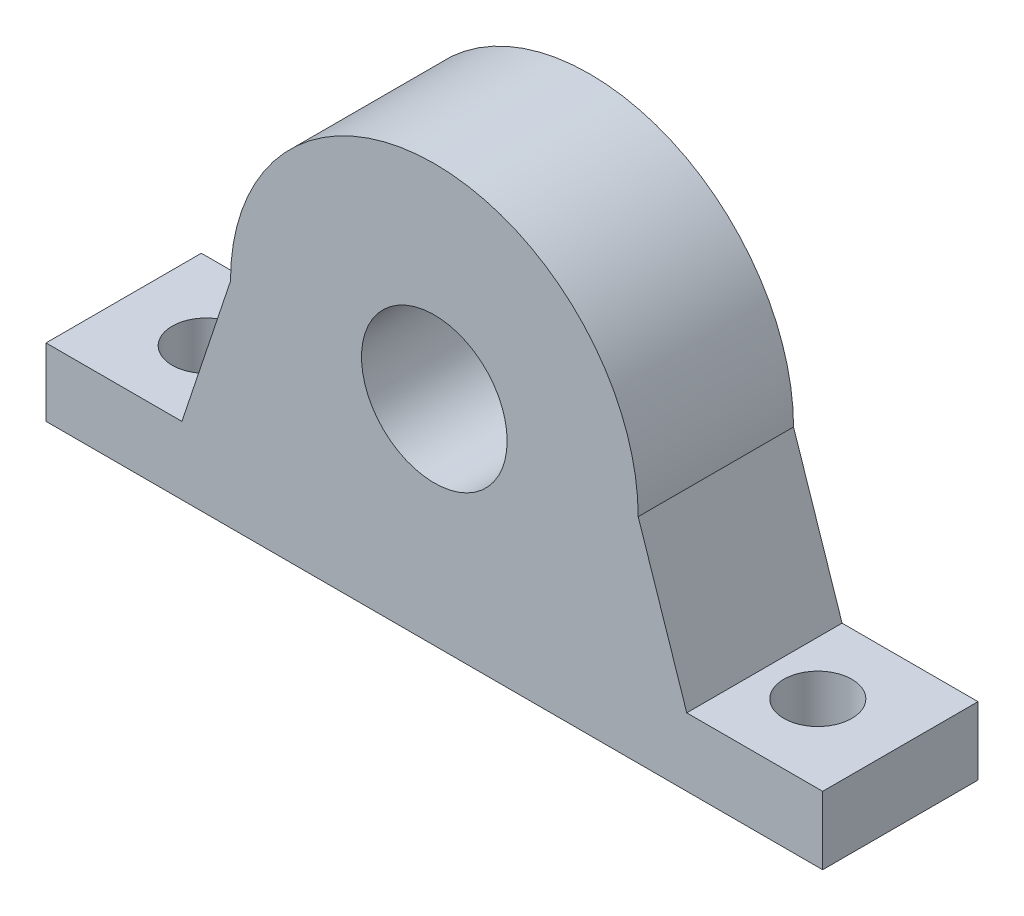
ISO-10303-21;
HEADER;
FILE_DESCRIPTION(('STEP AP214'),'2;1');
FILE_NAME('part.step','',(''),(''),'','','');
FILE_SCHEMA(('AUTOMOTIVE_DESIGN { 1 0 10303 214 1 1 1 1 }'));
ENDSEC;
DATA;
#1=APPLICATION_CONTEXT('core data for automotive mechanical design processes');
#2=APPLICATION_PROTOCOL_DEFINITION('international standard','automotive_design',2000,#1);
#3=PRODUCT_CONTEXT('',#1,'mechanical');
#4=PRODUCT('Part','Part','',(#3));
#5=PRODUCT_RELATED_PRODUCT_CATEGORY('part','',(#4));
#6=PRODUCT_DEFINITION_FORMATION('','',#4);
#7=PRODUCT_DEFINITION_CONTEXT('part definition',#1,'design');
#8=PRODUCT_DEFINITION('design','',#6,#7);
#9=PRODUCT_DEFINITION_SHAPE('','',#8);
#10=(LENGTH_UNIT() NAMED_UNIT(*) SI_UNIT(.MILLI.,.METRE.));
#11=(NAMED_UNIT(*) PLANE_ANGLE_UNIT() SI_UNIT($,.RADIAN.));
#12=(NAMED_UNIT(*) SI_UNIT($,.STERADIAN.) SOLID_ANGLE_UNIT());
#13=UNCERTAINTY_MEASURE_WITH_UNIT(LENGTH_MEASURE(1.E-05),#10,'distance_accuracy_value','');
#14=(GEOMETRIC_REPRESENTATION_CONTEXT(3) GLOBAL_UNCERTAINTY_ASSIGNED_CONTEXT((#13)) GLOBAL_UNIT_ASSIGNED_CONTEXT((#10,
#11,#12)) REPRESENTATION_CONTEXT('',''));
#15=CARTESIAN_POINT('',(0.,0.,0.));
#16=DIRECTION('',(0.,0.,1.));
#17=DIRECTION('',(1.,0.,0.));
#18=AXIS2_PLACEMENT_3D('',#15,#16,#17);
#19=CARTESIAN_POINT('',(0.,0.,16.));
#20=DIRECTION('',(0.,0.,-1.));
#21=DIRECTION('',(-1.,0.,0.));
#22=AXIS2_PLACEMENT_3D('',#19,#20,#21);
#23=PLANE('',#22);
#24=CARTESIAN_POINT('',(0.,0.,16.));
#25=DIRECTION('',(0.,0.,1.));
#26=DIRECTION('',(-1.,0.,0.));
#27=AXIS2_PLACEMENT_3D('',#24,#25,#26);
#28=CIRCLE('',#27,21.);
#29=CARTESIAN_POINT('',(21.,0.,16.));
#30=VERTEX_POINT('',#29);
#31=CARTESIAN_POINT('',(-21.,0.,16.));
#32=VERTEX_POINT('',#31);
#33=EDGE_CURVE('E147',#30,#32,#28,.T.);
#34=ORIENTED_EDGE('',*,*,#33,.T.);
#35=DIRECTION('',(-0.316227766016838,-0.948683298050514,0.));
#36=VECTOR('',#35,1.);
#37=CARTESIAN_POINT('',(-21.,0.,16.));
#38=LINE('',#37,#36);
#39=CARTESIAN_POINT('',(-26.,-15.,16.));
#40=VERTEX_POINT('',#39);
#41=EDGE_CURVE('E95',#32,#40,#38,.T.);
#42=ORIENTED_EDGE('',*,*,#41,.T.);
#43=DIRECTION('',(-1.,0.,0.));
#44=VECTOR('',#43,1.);
#45=CARTESIAN_POINT('',(-26.,-15.,16.));
#46=LINE('',#45,#44);
#47=CARTESIAN_POINT('',(-40.,-15.,16.));
#48=VERTEX_POINT('',#47);
#49=EDGE_CURVE('E162',#40,#48,#46,.T.);
#50=ORIENTED_EDGE('',*,*,#49,.T.);
#51=DIRECTION('',(0.,-1.,0.));
#52=VECTOR('',#51,1.);
#53=CARTESIAN_POINT('',(-40.,-15.,16.));
#54=LINE('',#53,#52);
#55=CARTESIAN_POINT('',(-40.,-22.,16.));
#56=VERTEX_POINT('',#55);
#57=EDGE_CURVE('E175',#48,#56,#54,.T.);
#58=ORIENTED_EDGE('',*,*,#57,.T.);
#59=DIRECTION('',(1.,0.,0.));
#60=VECTOR('',#59,1.);
#61=CARTESIAN_POINT('',(-40.,-22.,16.));
#62=LINE('',#61,#60);
#63=CARTESIAN_POINT('',(40.,-22.,16.));
#64=VERTEX_POINT('',#63);
#65=EDGE_CURVE('E114',#56,#64,#62,.T.);
#66=ORIENTED_EDGE('',*,*,#65,.T.);
#67=DIRECTION('',(0.,1.,0.));
#68=VECTOR('',#67,1.);
#69=CARTESIAN_POINT('',(40.,-22.,16.));
#70=LINE('',#69,#68);
#71=CARTESIAN_POINT('',(40.,-15.,16.));
#72=VERTEX_POINT('',#71);
#73=EDGE_CURVE('E108',#64,#72,#70,.T.);
#74=ORIENTED_EDGE('',*,*,#73,.T.);
#75=DIRECTION('',(-1.,0.,0.));
#76=VECTOR('',#75,1.);
#77=CARTESIAN_POINT('',(40.,-15.,16.));
#78=LINE('',#77,#76);
#79=CARTESIAN_POINT('',(26.,-15.,16.));
#80=VERTEX_POINT('',#79);
#81=EDGE_CURVE('E112',#72,#80,#78,.T.);
#82=ORIENTED_EDGE('',*,*,#81,.T.);
#83=DIRECTION('',(-0.316227766016838,0.948683298050514,0.));
#84=VECTOR('',#83,1.);
#85=CARTESIAN_POINT('',(26.,-15.,16.));
#86=LINE('',#85,#84);
#87=EDGE_CURVE('E52',#80,#30,#86,.T.);
#88=ORIENTED_EDGE('',*,*,#87,.T.);
#89=EDGE_LOOP('',(#34,#42,#50,#58,#66,#74,#82,#88));
#90=FACE_BOUND('',#89,.T.);
#91=CARTESIAN_POINT('',(0.,0.,16.));
#92=DIRECTION('',(0.,0.,1.));
#93=DIRECTION('',(1.,0.,0.));
#94=AXIS2_PLACEMENT_3D('',#91,#92,#93);
#95=CIRCLE('',#94,7.5);
#96=CARTESIAN_POINT('',(7.5,0.,16.));
#97=VERTEX_POINT('',#96);
#98=EDGE_CURVE('E136',#97,#97,#95,.T.);
#99=ORIENTED_EDGE('',*,*,#98,.F.);
#100=EDGE_LOOP('',(#99));
#101=FACE_BOUND('',#100,.T.);
#102=ADVANCED_FACE('F35',(#90,#101),#23,.F.);
#103=CARTESIAN_POINT('',(0.,0.,0.));
#104=DIRECTION('',(0.,0.,-1.));
#105=DIRECTION('',(-1.,0.,0.));
#106=AXIS2_PLACEMENT_3D('',#103,#104,#105);
#107=PLANE('',#106);
#108=CARTESIAN_POINT('',(0.,0.,0.));
#109=DIRECTION('',(0.,0.,1.));
#110=DIRECTION('',(-1.,0.,0.));
#111=AXIS2_PLACEMENT_3D('',#108,#109,#110);
#112=CIRCLE('',#111,21.);
#113=CARTESIAN_POINT('',(21.,0.,0.));
#114=VERTEX_POINT('',#113);
#115=CARTESIAN_POINT('',(-21.,0.,0.));
#116=VERTEX_POINT('',#115);
#117=EDGE_CURVE('E132',#114,#116,#112,.T.);
#118=ORIENTED_EDGE('',*,*,#117,.F.);
#119=DIRECTION('',(-0.316227766016838,0.948683298050514,0.));
#120=VECTOR('',#119,1.);
#121=CARTESIAN_POINT('',(26.,-15.,0.));
#122=LINE('',#121,#120);
#123=CARTESIAN_POINT('',(26.,-15.,0.));
#124=VERTEX_POINT('',#123);
#125=EDGE_CURVE('E87',#124,#114,#122,.T.);
#126=ORIENTED_EDGE('',*,*,#125,.F.);
#127=DIRECTION('',(-1.,0.,0.));
#128=VECTOR('',#127,1.);
#129=CARTESIAN_POINT('',(40.,-15.,0.));
#130=LINE('',#129,#128);
#131=CARTESIAN_POINT('',(40.,-15.,0.));
#132=VERTEX_POINT('',#131);
#133=EDGE_CURVE('E81',#132,#124,#130,.T.);
#134=ORIENTED_EDGE('',*,*,#133,.F.);
#135=DIRECTION('',(0.,1.,0.));
#136=VECTOR('',#135,1.);
#137=CARTESIAN_POINT('',(40.,-22.,0.));
#138=LINE('',#137,#136);
#139=CARTESIAN_POINT('',(40.,-22.,0.));
#140=VERTEX_POINT('',#139);
#141=EDGE_CURVE('E122',#140,#132,#138,.T.);
#142=ORIENTED_EDGE('',*,*,#141,.F.);
#143=DIRECTION('',(1.,0.,0.));
#144=VECTOR('',#143,1.);
#145=CARTESIAN_POINT('',(-40.,-22.,0.));
#146=LINE('',#145,#144);
#147=CARTESIAN_POINT('',(-40.,-22.,0.));
#148=VERTEX_POINT('',#147);
#149=EDGE_CURVE('E142',#148,#140,#146,.T.);
#150=ORIENTED_EDGE('',*,*,#149,.F.);
#151=DIRECTION('',(0.,-1.,0.));
#152=VECTOR('',#151,1.);
#153=CARTESIAN_POINT('',(-40.,-15.,0.));
#154=LINE('',#153,#152);
#155=CARTESIAN_POINT('',(-40.,-15.,0.));
#156=VERTEX_POINT('',#155);
#157=EDGE_CURVE('E140',#156,#148,#154,.T.);
#158=ORIENTED_EDGE('',*,*,#157,.F.);
#159=DIRECTION('',(-1.,0.,0.));
#160=VECTOR('',#159,1.);
#161=CARTESIAN_POINT('',(-26.,-15.,0.));
#162=LINE('',#161,#160);
#163=CARTESIAN_POINT('',(-26.,-15.,0.));
#164=VERTEX_POINT('',#163);
#165=EDGE_CURVE('E138',#164,#156,#162,.T.);
#166=ORIENTED_EDGE('',*,*,#165,.F.);
#167=DIRECTION('',(-0.316227766016838,-0.948683298050514,0.));
#168=VECTOR('',#167,1.);
#169=CARTESIAN_POINT('',(-21.,0.,0.));
#170=LINE('',#169,#168);
#171=EDGE_CURVE('E135',#116,#164,#170,.T.);
#172=ORIENTED_EDGE('',*,*,#171,.F.);
#173=EDGE_LOOP('',(#118,#126,#134,#142,#150,#158,#166,#172));
#174=FACE_BOUND('',#173,.T.);
#175=CARTESIAN_POINT('',(0.,0.,0.));
#176=DIRECTION('',(0.,0.,1.));
#177=DIRECTION('',(1.,0.,0.));
#178=AXIS2_PLACEMENT_3D('',#175,#176,#177);
#179=CIRCLE('',#178,7.5);
#180=CARTESIAN_POINT('',(7.5,0.,0.));
#181=VERTEX_POINT('',#180);
#182=EDGE_CURVE('E181',#181,#181,#179,.T.);
#183=ORIENTED_EDGE('',*,*,#182,.T.);
#184=EDGE_LOOP('',(#183));
#185=FACE_BOUND('',#184,.T.);
#186=ADVANCED_FACE('F166',(#174,#185),#107,.T.);
#187=CARTESIAN_POINT('',(0.,0.,16.));
#188=DIRECTION('',(0.,0.,-1.));
#189=DIRECTION('',(-1.,0.,0.));
#190=AXIS2_PLACEMENT_3D('',#187,#188,#189);
#191=CYLINDRICAL_SURFACE('',#190,21.);
#192=ORIENTED_EDGE('',*,*,#117,.T.);
#193=DIRECTION('',(0.,0.,-1.));
#194=VECTOR('',#193,1.);
#195=CARTESIAN_POINT('',(-21.,0.,16.));
#196=LINE('',#195,#194);
#197=EDGE_CURVE('E11',#32,#116,#196,.T.);
#198=ORIENTED_EDGE('',*,*,#197,.F.);
#199=ORIENTED_EDGE('',*,*,#33,.F.);
#200=DIRECTION('',(0.,0.,-1.));
#201=VECTOR('',#200,1.);
#202=CARTESIAN_POINT('',(21.,0.,16.));
#203=LINE('',#202,#201);
#204=EDGE_CURVE('E128',#30,#114,#203,.T.);
#205=ORIENTED_EDGE('',*,*,#204,.T.);
#206=EDGE_LOOP('',(#192,#198,#199,#205));
#207=FACE_BOUND('',#206,.T.);
#208=ADVANCED_FACE('F37',(#207),#191,.T.);
#209=CARTESIAN_POINT('',(-21.,0.,16.));
#210=DIRECTION('',(0.948683298050514,-0.316227766016838,0.));
#211=DIRECTION('',(0.316227766016838,0.948683298050514,0.));
#212=AXIS2_PLACEMENT_3D('',#209,#210,#211);
#213=PLANE('',#212);
#214=ORIENTED_EDGE('',*,*,#171,.T.);
#215=DIRECTION('',(0.,0.,-1.));
#216=VECTOR('',#215,1.);
#217=CARTESIAN_POINT('',(-26.,-15.,16.));
#218=LINE('',#217,#216);
#219=EDGE_CURVE('E44',#40,#164,#218,.T.);
#220=ORIENTED_EDGE('',*,*,#219,.F.);
#221=ORIENTED_EDGE('',*,*,#41,.F.);
#222=ORIENTED_EDGE('',*,*,#197,.T.);
#223=EDGE_LOOP('',(#214,#220,#221,#222));
#224=FACE_BOUND('',#223,.T.);
#225=ADVANCED_FACE('F209',(#224),#213,.F.);
#226=CARTESIAN_POINT('',(-26.,-15.,16.));
#227=DIRECTION('',(0.,-1.,0.));
#228=DIRECTION('',(1.,0.,0.));
#229=AXIS2_PLACEMENT_3D('',#226,#227,#228);
#230=PLANE('',#229);
#231=CARTESIAN_POINT('',(-31.5,-15.,8.));
#232=DIRECTION('',(0.,1.,0.));
#233=DIRECTION('',(-1.,0.,0.));
#234=AXIS2_PLACEMENT_3D('',#231,#232,#233);
#235=CIRCLE('',#234,3.5);
#236=CARTESIAN_POINT('',(-35.,-15.,8.));
#237=VERTEX_POINT('',#236);
#238=EDGE_CURVE('E193',#237,#237,#235,.T.);
#239=ORIENTED_EDGE('',*,*,#238,.F.);
#240=EDGE_LOOP('',(#239));
#241=FACE_BOUND('',#240,.T.);
#242=ORIENTED_EDGE('',*,*,#165,.T.);
#243=DIRECTION('',(0.,0.,-1.));
#244=VECTOR('',#243,1.);
#245=CARTESIAN_POINT('',(-40.,-15.,16.));
#246=LINE('',#245,#244);
#247=EDGE_CURVE('E154',#48,#156,#246,.T.);
#248=ORIENTED_EDGE('',*,*,#247,.F.);
#249=ORIENTED_EDGE('',*,*,#49,.F.);
#250=ORIENTED_EDGE('',*,*,#219,.T.);
#251=EDGE_LOOP('',(#242,#248,#249,#250));
#252=FACE_BOUND('',#251,.T.);
#253=ADVANCED_FACE('F160',(#241,#252),#230,.F.);
#254=CARTESIAN_POINT('',(-40.,-15.,16.));
#255=DIRECTION('',(1.,0.,0.));
#256=DIRECTION('',(0.,1.,0.));
#257=AXIS2_PLACEMENT_3D('',#254,#255,#256);
#258=PLANE('',#257);
#259=ORIENTED_EDGE('',*,*,#157,.T.);
#260=DIRECTION('',(0.,0.,-1.));
#261=VECTOR('',#260,1.);
#262=CARTESIAN_POINT('',(-40.,-22.,16.));
#263=LINE('',#262,#261);
#264=EDGE_CURVE('E151',#56,#148,#263,.T.);
#265=ORIENTED_EDGE('',*,*,#264,.F.);
#266=ORIENTED_EDGE('',*,*,#57,.F.);
#267=ORIENTED_EDGE('',*,*,#247,.T.);
#268=EDGE_LOOP('',(#259,#265,#266,#267));
#269=FACE_BOUND('',#268,.T.);
#270=ADVANCED_FACE('F171',(#269),#258,.F.);
#271=CARTESIAN_POINT('',(-40.,-22.,16.));
#272=DIRECTION('',(0.,1.,0.));
#273=DIRECTION('',(0.,0.,1.));
#274=AXIS2_PLACEMENT_3D('',#271,#272,#273);
#275=PLANE('',#274);
#276=CARTESIAN_POINT('',(-31.5,-22.,8.));
#277=DIRECTION('',(0.,1.,0.));
#278=DIRECTION('',(-1.,0.,0.));
#279=AXIS2_PLACEMENT_3D('',#276,#277,#278);
#280=CIRCLE('',#279,3.5);
#281=CARTESIAN_POINT('',(-35.,-22.,8.));
#282=VERTEX_POINT('',#281);
#283=EDGE_CURVE('E184',#282,#282,#280,.T.);
#284=ORIENTED_EDGE('',*,*,#283,.T.);
#285=EDGE_LOOP('',(#284));
#286=FACE_BOUND('',#285,.T.);
#287=CARTESIAN_POINT('',(31.5,-22.,8.));
#288=DIRECTION('',(0.,1.,0.));
#289=DIRECTION('',(-1.,0.,0.));
#290=AXIS2_PLACEMENT_3D('',#287,#288,#289);
#291=CIRCLE('',#290,3.49999999999999);
#292=CARTESIAN_POINT('',(28.,-22.,8.));
#293=VERTEX_POINT('',#292);
#294=EDGE_CURVE('E190',#293,#293,#291,.T.);
#295=ORIENTED_EDGE('',*,*,#294,.T.);
#296=EDGE_LOOP('',(#295));
#297=FACE_BOUND('',#296,.T.);
#298=ORIENTED_EDGE('',*,*,#149,.T.);
#299=DIRECTION('',(0.,0.,-1.));
#300=VECTOR('',#299,1.);
#301=CARTESIAN_POINT('',(40.,-22.,16.));
#302=LINE('',#301,#300);
#303=EDGE_CURVE('E123',#64,#140,#302,.T.);
#304=ORIENTED_EDGE('',*,*,#303,.F.);
#305=ORIENTED_EDGE('',*,*,#65,.F.);
#306=ORIENTED_EDGE('',*,*,#264,.T.);
#307=EDGE_LOOP('',(#298,#304,#305,#306));
#308=FACE_BOUND('',#307,.T.);
#309=ADVANCED_FACE('F174',(#286,#297,#308),#275,.F.);
#310=CARTESIAN_POINT('',(40.,-22.,16.));
#311=DIRECTION('',(-1.,0.,0.));
#312=DIRECTION('',(0.,-1.,0.));
#313=AXIS2_PLACEMENT_3D('',#310,#311,#312);
#314=PLANE('',#313);
#315=ORIENTED_EDGE('',*,*,#141,.T.);
#316=DIRECTION('',(0.,0.,-1.));
#317=VECTOR('',#316,1.);
#318=CARTESIAN_POINT('',(40.,-15.,16.));
#319=LINE('',#318,#317);
#320=EDGE_CURVE('E119',#72,#132,#319,.T.);
#321=ORIENTED_EDGE('',*,*,#320,.F.);
#322=ORIENTED_EDGE('',*,*,#73,.F.);
#323=ORIENTED_EDGE('',*,*,#303,.T.);
#324=EDGE_LOOP('',(#315,#321,#322,#323));
#325=FACE_BOUND('',#324,.T.);
#326=ADVANCED_FACE('F120',(#325),#314,.F.);
#327=CARTESIAN_POINT('',(40.,-15.,16.));
#328=DIRECTION('',(0.,-1.,0.));
#329=DIRECTION('',(1.,0.,0.));
#330=AXIS2_PLACEMENT_3D('',#327,#328,#329);
#331=PLANE('',#330);
#332=CARTESIAN_POINT('',(31.5,-15.,8.));
#333=DIRECTION('',(0.,1.,0.));
#334=DIRECTION('',(-1.,0.,0.));
#335=AXIS2_PLACEMENT_3D('',#332,#333,#334);
#336=CIRCLE('',#335,3.49999999999999);
#337=CARTESIAN_POINT('',(28.,-15.,8.));
#338=VERTEX_POINT('',#337);
#339=EDGE_CURVE('E187',#338,#338,#336,.T.);
#340=ORIENTED_EDGE('',*,*,#339,.F.);
#341=EDGE_LOOP('',(#340));
#342=FACE_BOUND('',#341,.T.);
#343=ORIENTED_EDGE('',*,*,#133,.T.);
#344=DIRECTION('',(0.,0.,-1.));
#345=VECTOR('',#344,1.);
#346=CARTESIAN_POINT('',(26.,-15.,16.));
#347=LINE('',#346,#345);
#348=EDGE_CURVE('E124',#80,#124,#347,.T.);
#349=ORIENTED_EDGE('',*,*,#348,.F.);
#350=ORIENTED_EDGE('',*,*,#81,.F.);
#351=ORIENTED_EDGE('',*,*,#320,.T.);
#352=EDGE_LOOP('',(#343,#349,#350,#351));
#353=FACE_BOUND('',#352,.T.);
#354=ADVANCED_FACE('F126',(#342,#353),#331,.F.);
#355=CARTESIAN_POINT('',(26.,-15.,16.));
#356=DIRECTION('',(-0.948683298050514,-0.316227766016838,0.));
#357=DIRECTION('',(0.316227766016838,-0.948683298050514,0.));
#358=AXIS2_PLACEMENT_3D('',#355,#356,#357);
#359=PLANE('',#358);
#360=ORIENTED_EDGE('',*,*,#125,.T.);
#361=ORIENTED_EDGE('',*,*,#204,.F.);
#362=ORIENTED_EDGE('',*,*,#87,.F.);
#363=ORIENTED_EDGE('',*,*,#348,.T.);
#364=EDGE_LOOP('',(#360,#361,#362,#363));
#365=FACE_BOUND('',#364,.T.);
#366=ADVANCED_FACE('F226',(#365),#359,.F.);
#367=CARTESIAN_POINT('',(0.,0.,16.));
#368=DIRECTION('',(0.,0.,-1.));
#369=DIRECTION('',(-1.,0.,0.));
#370=AXIS2_PLACEMENT_3D('',#367,#368,#369);
#371=CYLINDRICAL_SURFACE('',#370,7.5);
#372=ORIENTED_EDGE('',*,*,#98,.T.);
#373=EDGE_LOOP('',(#372));
#374=FACE_BOUND('',#373,.T.);
#375=ORIENTED_EDGE('',*,*,#182,.F.);
#376=EDGE_LOOP('',(#375));
#377=FACE_BOUND('',#376,.T.);
#378=ADVANCED_FACE('F223',(#374,#377),#371,.F.);
#379=CARTESIAN_POINT('',(31.5,-22.,8.));
#380=DIRECTION('',(0.,1.,0.));
#381=DIRECTION('',(-1.,0.,0.));
#382=AXIS2_PLACEMENT_3D('',#379,#380,#381);
#383=CYLINDRICAL_SURFACE('',#382,3.49999999999999);
#384=ORIENTED_EDGE('',*,*,#294,.F.);
#385=EDGE_LOOP('',(#384));
#386=FACE_BOUND('',#385,.T.);
#387=ORIENTED_EDGE('',*,*,#339,.T.);
#388=EDGE_LOOP('',(#387));
#389=FACE_BOUND('',#388,.T.);
#390=ADVANCED_FACE('F204',(#386,#389),#383,.F.);
#391=CARTESIAN_POINT('',(-31.5,-22.,8.));
#392=DIRECTION('',(0.,1.,0.));
#393=DIRECTION('',(-1.,0.,0.));
#394=AXIS2_PLACEMENT_3D('',#391,#392,#393);
#395=CYLINDRICAL_SURFACE('',#394,3.5);
#396=ORIENTED_EDGE('',*,*,#283,.F.);
#397=EDGE_LOOP('',(#396));
#398=FACE_BOUND('',#397,.T.);
#399=ORIENTED_EDGE('',*,*,#238,.T.);
#400=EDGE_LOOP('',(#399));
#401=FACE_BOUND('',#400,.T.);
#402=ADVANCED_FACE('F201',(#398,#401),#395,.F.);
#403=CLOSED_SHELL('',(#102,#186,#208,#225,#253,#270,#309,#326,#354,#366,#378,#390,#402));
#404=MANIFOLD_SOLID_BREP('B2',#403);
#405=ADVANCED_BREP_SHAPE_REPRESENTATION('',(#18,#404),#14);
#406=SHAPE_DEFINITION_REPRESENTATION(#9,#405);
ENDSEC;
END-ISO-10303-21;
